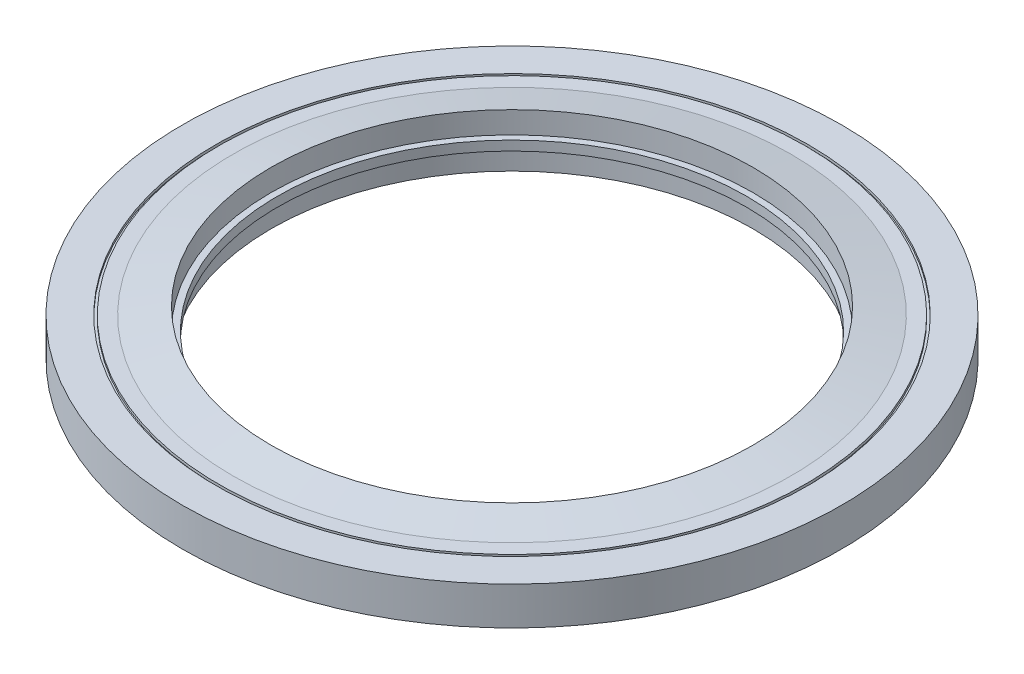
ISO-10303-21;
HEADER;
FILE_DESCRIPTION(('STEP AP214'),'2;1');
FILE_NAME('part.step','',(''),(''),'','','');
FILE_SCHEMA(('AUTOMOTIVE_DESIGN { 1 0 10303 214 1 1 1 1 }'));
ENDSEC;
DATA;
#1=APPLICATION_CONTEXT('core data for automotive mechanical design processes');
#2=APPLICATION_PROTOCOL_DEFINITION('international standard','automotive_design',2000,#1);
#3=PRODUCT_CONTEXT('',#1,'mechanical');
#4=PRODUCT('Part','Part','',(#3));
#5=PRODUCT_RELATED_PRODUCT_CATEGORY('part','',(#4));
#6=PRODUCT_DEFINITION_FORMATION('','',#4);
#7=PRODUCT_DEFINITION_CONTEXT('part definition',#1,'design');
#8=PRODUCT_DEFINITION('design','',#6,#7);
#9=PRODUCT_DEFINITION_SHAPE('','',#8);
#10=(LENGTH_UNIT() NAMED_UNIT(*) SI_UNIT(.MILLI.,.METRE.));
#11=(NAMED_UNIT(*) PLANE_ANGLE_UNIT() SI_UNIT($,.RADIAN.));
#12=(NAMED_UNIT(*) SI_UNIT($,.STERADIAN.) SOLID_ANGLE_UNIT());
#13=UNCERTAINTY_MEASURE_WITH_UNIT(LENGTH_MEASURE(1.E-05),#10,'distance_accuracy_value','');
#14=(GEOMETRIC_REPRESENTATION_CONTEXT(3) GLOBAL_UNCERTAINTY_ASSIGNED_CONTEXT((#13)) GLOBAL_UNIT_ASSIGNED_CONTEXT((#10,
#11,#12)) REPRESENTATION_CONTEXT('',''));
#15=CARTESIAN_POINT('',(0.,0.,0.));
#16=DIRECTION('',(0.,0.,1.));
#17=DIRECTION('',(1.,0.,0.));
#18=AXIS2_PLACEMENT_3D('',#15,#16,#17);
#19=CARTESIAN_POINT('',(9.25,-0.187500000000001,0.));
#20=DIRECTION('',(0.,-1.,0.));
#21=DIRECTION('',(0.,0.,-1.));
#22=AXIS2_PLACEMENT_3D('',#19,#20,#21);
#23=PLANE('',#22);
#24=CARTESIAN_POINT('',(0.,-0.187500000000001,0.));
#25=DIRECTION('',(0.,-1.,0.));
#26=DIRECTION('',(0.,0.,-1.));
#27=AXIS2_PLACEMENT_3D('',#24,#25,#26);
#28=CIRCLE('',#27,9.49999999999999);
#29=CARTESIAN_POINT('',(0.,-0.187500000000001,-9.49999999999999));
#30=VERTEX_POINT('',#29);
#31=EDGE_CURVE('E10',#30,#30,#28,.T.);
#32=ORIENTED_EDGE('',*,*,#31,.T.);
#33=EDGE_LOOP('',(#32));
#34=FACE_BOUND('',#33,.T.);
#35=CARTESIAN_POINT('',(0.,-0.187500000000001,0.));
#36=DIRECTION('',(0.,-1.,0.));
#37=DIRECTION('',(0.,0.,-1.));
#38=AXIS2_PLACEMENT_3D('',#35,#36,#37);
#39=CIRCLE('',#38,9.25);
#40=CARTESIAN_POINT('',(0.,-0.187500000000001,-9.25));
#41=VERTEX_POINT('',#40);
#42=EDGE_CURVE('E103',#41,#41,#39,.T.);
#43=ORIENTED_EDGE('',*,*,#42,.F.);
#44=EDGE_LOOP('',(#43));
#45=FACE_BOUND('',#44,.T.);
#46=ADVANCED_FACE('F45',(#34,#45),#23,.T.);
#47=CARTESIAN_POINT('',(0.,0.,0.));
#48=DIRECTION('',(0.,-1.,0.));
#49=DIRECTION('',(0.,0.,-1.));
#50=AXIS2_PLACEMENT_3D('',#47,#48,#49);
#51=CYLINDRICAL_SURFACE('',#50,9.49999999999999);
#52=CARTESIAN_POINT('',(0.,-1.05,0.));
#53=DIRECTION('',(0.,-1.,0.));
#54=DIRECTION('',(0.,0.,-1.));
#55=AXIS2_PLACEMENT_3D('',#52,#53,#54);
#56=CIRCLE('',#55,9.49999999999999);
#57=CARTESIAN_POINT('',(0.,-1.05,-9.49999999999999));
#58=VERTEX_POINT('',#57);
#59=EDGE_CURVE('E51',#58,#58,#56,.T.);
#60=ORIENTED_EDGE('',*,*,#59,.T.);
#61=EDGE_LOOP('',(#60));
#62=FACE_BOUND('',#61,.T.);
#63=ORIENTED_EDGE('',*,*,#31,.F.);
#64=EDGE_LOOP('',(#63));
#65=FACE_BOUND('',#64,.T.);
#66=ADVANCED_FACE('F111',(#62,#65),#51,.F.);
#67=CARTESIAN_POINT('',(0.,-1.05,0.));
#68=DIRECTION('',(0.,1.,0.));
#69=DIRECTION('',(0.,0.,1.));
#70=AXIS2_PLACEMENT_3D('',#67,#68,#69);
#71=CONICAL_SURFACE('',#70,9.49999999999999,1.37340076694502);
#72=CARTESIAN_POINT('',(0.,-0.750000000000001,0.));
#73=DIRECTION('',(0.,-1.,0.));
#74=DIRECTION('',(0.,0.,-1.));
#75=AXIS2_PLACEMENT_3D('',#72,#73,#74);
#76=CIRCLE('',#75,11.);
#77=CARTESIAN_POINT('',(0.,-0.750000000000001,-11.));
#78=VERTEX_POINT('',#77);
#79=EDGE_CURVE('E55',#78,#78,#76,.T.);
#80=ORIENTED_EDGE('',*,*,#79,.T.);
#81=EDGE_LOOP('',(#80));
#82=FACE_BOUND('',#81,.T.);
#83=ORIENTED_EDGE('',*,*,#59,.F.);
#84=EDGE_LOOP('',(#83));
#85=FACE_BOUND('',#84,.T.);
#86=ADVANCED_FACE('F115',(#82,#85),#71,.T.);
#87=CARTESIAN_POINT('',(11.,-0.750000000000001,0.));
#88=DIRECTION('',(0.,-1.,0.));
#89=DIRECTION('',(0.,0.,-1.));
#90=AXIS2_PLACEMENT_3D('',#87,#88,#89);
#91=PLANE('',#90);
#92=CARTESIAN_POINT('',(0.,-0.750000000000001,0.));
#93=DIRECTION('',(0.,-1.,0.));
#94=DIRECTION('',(0.,0.,-1.));
#95=AXIS2_PLACEMENT_3D('',#92,#93,#94);
#96=CIRCLE('',#95,11.5666666666667);
#97=CARTESIAN_POINT('',(0.,-0.750000000000001,-11.5666666666667));
#98=VERTEX_POINT('',#97);
#99=EDGE_CURVE('E59',#98,#98,#96,.T.);
#100=ORIENTED_EDGE('',*,*,#99,.T.);
#101=EDGE_LOOP('',(#100));
#102=FACE_BOUND('',#101,.T.);
#103=ORIENTED_EDGE('',*,*,#79,.F.);
#104=EDGE_LOOP('',(#103));
#105=FACE_BOUND('',#104,.T.);
#106=ADVANCED_FACE('F119',(#102,#105),#91,.T.);
#107=CARTESIAN_POINT('',(0.,0.,0.));
#108=DIRECTION('',(0.,-1.,0.));
#109=DIRECTION('',(0.,0.,-1.));
#110=AXIS2_PLACEMENT_3D('',#107,#108,#109);
#111=CYLINDRICAL_SURFACE('',#110,11.5666666666667);
#112=CARTESIAN_POINT('',(0.,-0.650000000000001,0.));
#113=DIRECTION('',(0.,-1.,0.));
#114=DIRECTION('',(0.,0.,-1.));
#115=AXIS2_PLACEMENT_3D('',#112,#113,#114);
#116=CIRCLE('',#115,11.5666666666667);
#117=CARTESIAN_POINT('',(0.,-0.650000000000001,-11.5666666666667));
#118=VERTEX_POINT('',#117);
#119=EDGE_CURVE('E64',#118,#118,#116,.T.);
#120=ORIENTED_EDGE('',*,*,#119,.T.);
#121=EDGE_LOOP('',(#120));
#122=FACE_BOUND('',#121,.T.);
#123=ORIENTED_EDGE('',*,*,#99,.F.);
#124=EDGE_LOOP('',(#123));
#125=FACE_BOUND('',#124,.T.);
#126=ADVANCED_FACE('F126',(#122,#125),#111,.T.);
#127=CARTESIAN_POINT('',(11.6666666666667,-0.650000000000001,0.));
#128=DIRECTION('',(0.,-1.,0.));
#129=DIRECTION('',(0.,0.,-1.));
#130=AXIS2_PLACEMENT_3D('',#127,#128,#129);
#131=PLANE('',#130);
#132=CARTESIAN_POINT('',(0.,-0.650000000000001,0.));
#133=DIRECTION('',(0.,-1.,0.));
#134=DIRECTION('',(0.,0.,-1.));
#135=AXIS2_PLACEMENT_3D('',#132,#133,#134);
#136=CIRCLE('',#135,11.6666666666667);
#137=CARTESIAN_POINT('',(0.,-0.650000000000001,-11.6666666666667));
#138=VERTEX_POINT('',#137);
#139=EDGE_CURVE('E67',#138,#138,#136,.T.);
#140=ORIENTED_EDGE('',*,*,#139,.T.);
#141=EDGE_LOOP('',(#140));
#142=FACE_BOUND('',#141,.T.);
#143=ORIENTED_EDGE('',*,*,#119,.F.);
#144=EDGE_LOOP('',(#143));
#145=FACE_BOUND('',#144,.T.);
#146=ADVANCED_FACE('F130',(#142,#145),#131,.T.);
#147=CARTESIAN_POINT('',(0.,0.,0.));
#148=DIRECTION('',(0.,-1.,0.));
#149=DIRECTION('',(0.,0.,-1.));
#150=AXIS2_PLACEMENT_3D('',#147,#148,#149);
#151=CYLINDRICAL_SURFACE('',#150,11.6666666666667);
#152=CARTESIAN_POINT('',(0.,-0.750000000000001,0.));
#153=DIRECTION('',(0.,-1.,0.));
#154=DIRECTION('',(0.,0.,-1.));
#155=AXIS2_PLACEMENT_3D('',#152,#153,#154);
#156=CIRCLE('',#155,11.6666666666667);
#157=CARTESIAN_POINT('',(0.,-0.750000000000001,-11.6666666666667));
#158=VERTEX_POINT('',#157);
#159=EDGE_CURVE('E70',#158,#158,#156,.T.);
#160=ORIENTED_EDGE('',*,*,#159,.T.);
#161=EDGE_LOOP('',(#160));
#162=FACE_BOUND('',#161,.T.);
#163=ORIENTED_EDGE('',*,*,#139,.F.);
#164=EDGE_LOOP('',(#163));
#165=FACE_BOUND('',#164,.T.);
#166=ADVANCED_FACE('F134',(#162,#165),#151,.F.);
#167=CARTESIAN_POINT('',(11.6666666666667,-0.750000000000001,0.));
#168=DIRECTION('',(0.,-1.,0.));
#169=DIRECTION('',(0.,0.,-1.));
#170=AXIS2_PLACEMENT_3D('',#167,#168,#169);
#171=PLANE('',#170);
#172=CARTESIAN_POINT('',(0.,-0.75,0.));
#173=DIRECTION('',(0.,-1.,0.));
#174=DIRECTION('',(0.,0.,-1.));
#175=AXIS2_PLACEMENT_3D('',#172,#173,#174);
#176=CIRCLE('',#175,13.);
#177=CARTESIAN_POINT('',(0.,-0.75,-13.));
#178=VERTEX_POINT('',#177);
#179=EDGE_CURVE('E73',#178,#178,#176,.T.);
#180=ORIENTED_EDGE('',*,*,#179,.T.);
#181=EDGE_LOOP('',(#180));
#182=FACE_BOUND('',#181,.T.);
#183=ORIENTED_EDGE('',*,*,#159,.F.);
#184=EDGE_LOOP('',(#183));
#185=FACE_BOUND('',#184,.T.);
#186=ADVANCED_FACE('F138',(#182,#185),#171,.T.);
#187=CARTESIAN_POINT('',(0.,0.,0.));
#188=DIRECTION('',(0.,-1.,0.));
#189=DIRECTION('',(0.,0.,-1.));
#190=AXIS2_PLACEMENT_3D('',#187,#188,#189);
#191=CYLINDRICAL_SURFACE('',#190,13.);
#192=CARTESIAN_POINT('',(0.,0.75,0.));
#193=DIRECTION('',(0.,-1.,0.));
#194=DIRECTION('',(0.,0.,-1.));
#195=AXIS2_PLACEMENT_3D('',#192,#193,#194);
#196=CIRCLE('',#195,13.);
#197=CARTESIAN_POINT('',(0.,0.75,-13.));
#198=VERTEX_POINT('',#197);
#199=EDGE_CURVE('E76',#198,#198,#196,.T.);
#200=ORIENTED_EDGE('',*,*,#199,.T.);
#201=EDGE_LOOP('',(#200));
#202=FACE_BOUND('',#201,.T.);
#203=ORIENTED_EDGE('',*,*,#179,.F.);
#204=EDGE_LOOP('',(#203));
#205=FACE_BOUND('',#204,.T.);
#206=ADVANCED_FACE('F142',(#202,#205),#191,.T.);
#207=CARTESIAN_POINT('',(13.,0.749999999999999,0.));
#208=DIRECTION('',(0.,1.,0.));
#209=DIRECTION('',(0.,0.,1.));
#210=AXIS2_PLACEMENT_3D('',#207,#208,#209);
#211=PLANE('',#210);
#212=CARTESIAN_POINT('',(0.,0.749999999999999,0.));
#213=DIRECTION('',(0.,-1.,0.));
#214=DIRECTION('',(0.,0.,-1.));
#215=AXIS2_PLACEMENT_3D('',#212,#213,#214);
#216=CIRCLE('',#215,11.6666666666667);
#217=CARTESIAN_POINT('',(0.,0.749999999999999,-11.6666666666667));
#218=VERTEX_POINT('',#217);
#219=EDGE_CURVE('E79',#218,#218,#216,.T.);
#220=ORIENTED_EDGE('',*,*,#219,.T.);
#221=EDGE_LOOP('',(#220));
#222=FACE_BOUND('',#221,.T.);
#223=ORIENTED_EDGE('',*,*,#199,.F.);
#224=EDGE_LOOP('',(#223));
#225=FACE_BOUND('',#224,.T.);
#226=ADVANCED_FACE('F146',(#222,#225),#211,.T.);
#227=CARTESIAN_POINT('',(0.,0.,0.));
#228=DIRECTION('',(0.,-1.,0.));
#229=DIRECTION('',(0.,0.,-1.));
#230=AXIS2_PLACEMENT_3D('',#227,#228,#229);
#231=CYLINDRICAL_SURFACE('',#230,11.6666666666667);
#232=CARTESIAN_POINT('',(0.,0.649999999999999,0.));
#233=DIRECTION('',(0.,-1.,0.));
#234=DIRECTION('',(0.,0.,-1.));
#235=AXIS2_PLACEMENT_3D('',#232,#233,#234);
#236=CIRCLE('',#235,11.6666666666667);
#237=CARTESIAN_POINT('',(0.,0.649999999999999,-11.6666666666667));
#238=VERTEX_POINT('',#237);
#239=EDGE_CURVE('E82',#238,#238,#236,.T.);
#240=ORIENTED_EDGE('',*,*,#239,.T.);
#241=EDGE_LOOP('',(#240));
#242=FACE_BOUND('',#241,.T.);
#243=ORIENTED_EDGE('',*,*,#219,.F.);
#244=EDGE_LOOP('',(#243));
#245=FACE_BOUND('',#244,.T.);
#246=ADVANCED_FACE('F150',(#242,#245),#231,.F.);
#247=CARTESIAN_POINT('',(11.6666666666667,0.649999999999999,0.));
#248=DIRECTION('',(0.,1.,0.));
#249=DIRECTION('',(0.,0.,1.));
#250=AXIS2_PLACEMENT_3D('',#247,#248,#249);
#251=PLANE('',#250);
#252=CARTESIAN_POINT('',(0.,0.649999999999999,0.));
#253=DIRECTION('',(0.,-1.,0.));
#254=DIRECTION('',(0.,0.,-1.));
#255=AXIS2_PLACEMENT_3D('',#252,#253,#254);
#256=CIRCLE('',#255,11.5666666666667);
#257=CARTESIAN_POINT('',(0.,0.649999999999999,-11.5666666666667));
#258=VERTEX_POINT('',#257);
#259=EDGE_CURVE('E85',#258,#258,#256,.T.);
#260=ORIENTED_EDGE('',*,*,#259,.T.);
#261=EDGE_LOOP('',(#260));
#262=FACE_BOUND('',#261,.T.);
#263=ORIENTED_EDGE('',*,*,#239,.F.);
#264=EDGE_LOOP('',(#263));
#265=FACE_BOUND('',#264,.T.);
#266=ADVANCED_FACE('F154',(#262,#265),#251,.T.);
#267=CARTESIAN_POINT('',(0.,0.,0.));
#268=DIRECTION('',(0.,-1.,0.));
#269=DIRECTION('',(0.,0.,-1.));
#270=AXIS2_PLACEMENT_3D('',#267,#268,#269);
#271=CYLINDRICAL_SURFACE('',#270,11.5666666666667);
#272=CARTESIAN_POINT('',(0.,0.75,0.));
#273=DIRECTION('',(0.,-1.,0.));
#274=DIRECTION('',(0.,0.,-1.));
#275=AXIS2_PLACEMENT_3D('',#272,#273,#274);
#276=CIRCLE('',#275,11.5666666666667);
#277=CARTESIAN_POINT('',(0.,0.75,-11.5666666666667));
#278=VERTEX_POINT('',#277);
#279=EDGE_CURVE('E88',#278,#278,#276,.T.);
#280=ORIENTED_EDGE('',*,*,#279,.T.);
#281=EDGE_LOOP('',(#280));
#282=FACE_BOUND('',#281,.T.);
#283=ORIENTED_EDGE('',*,*,#259,.F.);
#284=EDGE_LOOP('',(#283));
#285=FACE_BOUND('',#284,.T.);
#286=ADVANCED_FACE('F158',(#282,#285),#271,.T.);
#287=CARTESIAN_POINT('',(11.,0.75,0.));
#288=DIRECTION('',(0.,1.,0.));
#289=DIRECTION('',(0.,0.,1.));
#290=AXIS2_PLACEMENT_3D('',#287,#288,#289);
#291=PLANE('',#290);
#292=CARTESIAN_POINT('',(0.,0.75,0.));
#293=DIRECTION('',(0.,-1.,0.));
#294=DIRECTION('',(0.,0.,-1.));
#295=AXIS2_PLACEMENT_3D('',#292,#293,#294);
#296=CIRCLE('',#295,11.);
#297=CARTESIAN_POINT('',(0.,0.75,-11.));
#298=VERTEX_POINT('',#297);
#299=EDGE_CURVE('E91',#298,#298,#296,.T.);
#300=ORIENTED_EDGE('',*,*,#299,.T.);
#301=EDGE_LOOP('',(#300));
#302=FACE_BOUND('',#301,.T.);
#303=ORIENTED_EDGE('',*,*,#279,.F.);
#304=EDGE_LOOP('',(#303));
#305=FACE_BOUND('',#304,.T.);
#306=ADVANCED_FACE('F162',(#302,#305),#291,.T.);
#307=CARTESIAN_POINT('',(0.,0.75,0.));
#308=DIRECTION('',(0.,-1.,0.));
#309=DIRECTION('',(0.,0.,-1.));
#310=AXIS2_PLACEMENT_3D('',#307,#308,#309);
#311=CONICAL_SURFACE('',#310,11.,1.37340076694502);
#312=CARTESIAN_POINT('',(0.,1.05,0.));
#313=DIRECTION('',(0.,-1.,0.));
#314=DIRECTION('',(0.,0.,-1.));
#315=AXIS2_PLACEMENT_3D('',#312,#313,#314);
#316=CIRCLE('',#315,9.49999999999999);
#317=CARTESIAN_POINT('',(0.,1.05,-9.49999999999999));
#318=VERTEX_POINT('',#317);
#319=EDGE_CURVE('E94',#318,#318,#316,.T.);
#320=ORIENTED_EDGE('',*,*,#319,.T.);
#321=EDGE_LOOP('',(#320));
#322=FACE_BOUND('',#321,.T.);
#323=ORIENTED_EDGE('',*,*,#299,.F.);
#324=EDGE_LOOP('',(#323));
#325=FACE_BOUND('',#324,.T.);
#326=ADVANCED_FACE('F166',(#322,#325),#311,.T.);
#327=CARTESIAN_POINT('',(0.,0.,0.));
#328=DIRECTION('',(0.,-1.,0.));
#329=DIRECTION('',(0.,0.,-1.));
#330=AXIS2_PLACEMENT_3D('',#327,#328,#329);
#331=CYLINDRICAL_SURFACE('',#330,9.49999999999999);
#332=CARTESIAN_POINT('',(0.,0.187499999999999,0.));
#333=DIRECTION('',(0.,-1.,0.));
#334=DIRECTION('',(0.,0.,-1.));
#335=AXIS2_PLACEMENT_3D('',#332,#333,#334);
#336=CIRCLE('',#335,9.49999999999999);
#337=CARTESIAN_POINT('',(0.,0.187499999999999,-9.49999999999999));
#338=VERTEX_POINT('',#337);
#339=EDGE_CURVE('E97',#338,#338,#336,.T.);
#340=ORIENTED_EDGE('',*,*,#339,.T.);
#341=EDGE_LOOP('',(#340));
#342=FACE_BOUND('',#341,.T.);
#343=ORIENTED_EDGE('',*,*,#319,.F.);
#344=EDGE_LOOP('',(#343));
#345=FACE_BOUND('',#344,.T.);
#346=ADVANCED_FACE('F170',(#342,#345),#331,.F.);
#347=CARTESIAN_POINT('',(9.25,0.187499999999999,0.));
#348=DIRECTION('',(0.,1.,0.));
#349=DIRECTION('',(0.,0.,1.));
#350=AXIS2_PLACEMENT_3D('',#347,#348,#349);
#351=PLANE('',#350);
#352=CARTESIAN_POINT('',(0.,0.187499999999999,0.));
#353=DIRECTION('',(0.,-1.,0.));
#354=DIRECTION('',(0.,0.,-1.));
#355=AXIS2_PLACEMENT_3D('',#352,#353,#354);
#356=CIRCLE('',#355,9.25);
#357=CARTESIAN_POINT('',(0.,0.187499999999999,-9.25));
#358=VERTEX_POINT('',#357);
#359=EDGE_CURVE('E100',#358,#358,#356,.T.);
#360=ORIENTED_EDGE('',*,*,#359,.T.);
#361=EDGE_LOOP('',(#360));
#362=FACE_BOUND('',#361,.T.);
#363=ORIENTED_EDGE('',*,*,#339,.F.);
#364=EDGE_LOOP('',(#363));
#365=FACE_BOUND('',#364,.T.);
#366=ADVANCED_FACE('F174',(#362,#365),#351,.T.);
#367=CARTESIAN_POINT('',(0.,0.,0.));
#368=DIRECTION('',(0.,-1.,0.));
#369=DIRECTION('',(0.,0.,-1.));
#370=AXIS2_PLACEMENT_3D('',#367,#368,#369);
#371=CYLINDRICAL_SURFACE('',#370,9.25);
#372=ORIENTED_EDGE('',*,*,#42,.T.);
#373=EDGE_LOOP('',(#372));
#374=FACE_BOUND('',#373,.T.);
#375=ORIENTED_EDGE('',*,*,#359,.F.);
#376=EDGE_LOOP('',(#375));
#377=FACE_BOUND('',#376,.T.);
#378=ADVANCED_FACE('F107',(#374,#377),#371,.F.);
#379=CLOSED_SHELL('',(#46,#66,#86,#106,#126,#146,#166,#186,#206,#226,#246,#266,#286,#306,#326,
#346,#366,#378));
#380=MANIFOLD_SOLID_BREP('B2',#379);
#381=ADVANCED_BREP_SHAPE_REPRESENTATION('',(#18,#380),#14);
#382=SHAPE_DEFINITION_REPRESENTATION(#9,#381);
ENDSEC;
END-ISO-10303-21;
